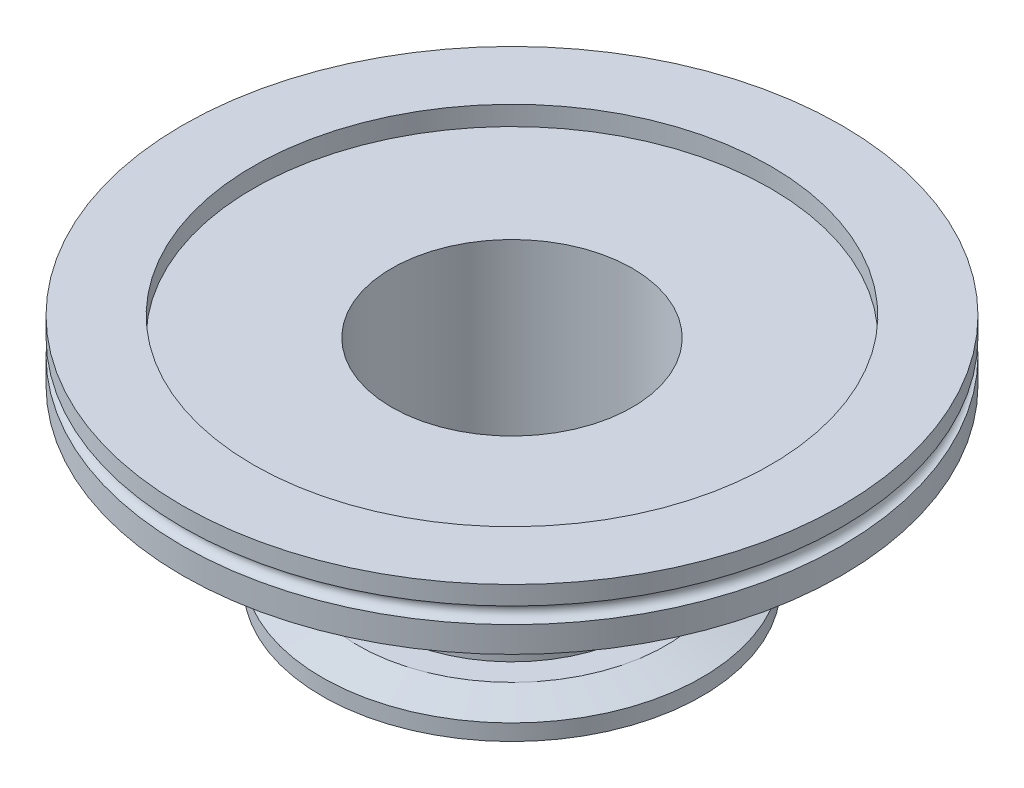
ISO-10303-21;
HEADER;
FILE_DESCRIPTION(('STEP AP214'),'2;1');
FILE_NAME('part.step','',(''),(''),'','','');
FILE_SCHEMA(('AUTOMOTIVE_DESIGN { 1 0 10303 214 1 1 1 1 }'));
ENDSEC;
DATA;
#1=APPLICATION_CONTEXT('core data for automotive mechanical design processes');
#2=APPLICATION_PROTOCOL_DEFINITION('international standard','automotive_design',2000,#1);
#3=PRODUCT_CONTEXT('',#1,'mechanical');
#4=PRODUCT('Part','Part','',(#3));
#5=PRODUCT_RELATED_PRODUCT_CATEGORY('part','',(#4));
#6=PRODUCT_DEFINITION_FORMATION('','',#4);
#7=PRODUCT_DEFINITION_CONTEXT('part definition',#1,'design');
#8=PRODUCT_DEFINITION('design','',#6,#7);
#9=PRODUCT_DEFINITION_SHAPE('','',#8);
#10=(LENGTH_UNIT() NAMED_UNIT(*) SI_UNIT(.MILLI.,.METRE.));
#11=(NAMED_UNIT(*) PLANE_ANGLE_UNIT() SI_UNIT($,.RADIAN.));
#12=(NAMED_UNIT(*) SI_UNIT($,.STERADIAN.) SOLID_ANGLE_UNIT());
#13=UNCERTAINTY_MEASURE_WITH_UNIT(LENGTH_MEASURE(1.E-05),#10,'distance_accuracy_value','');
#14=(GEOMETRIC_REPRESENTATION_CONTEXT(3) GLOBAL_UNCERTAINTY_ASSIGNED_CONTEXT((#13)) GLOBAL_UNIT_ASSIGNED_CONTEXT((#10,
#11,#12)) REPRESENTATION_CONTEXT('',''));
#15=CARTESIAN_POINT('',(0.,0.,0.));
#16=DIRECTION('',(0.,0.,1.));
#17=DIRECTION('',(1.,0.,0.));
#18=AXIS2_PLACEMENT_3D('',#15,#16,#17);
#19=CARTESIAN_POINT('',(0.,5.96900000000001,0.));
#20=DIRECTION('',(0.,1.,0.));
#21=DIRECTION('',(-1.,0.,0.));
#22=AXIS2_PLACEMENT_3D('',#19,#20,#21);
#23=CYLINDRICAL_SURFACE('',#22,64.9999999972);
#24=CARTESIAN_POINT('',(0.,2.28599999999999,0.));
#25=DIRECTION('',(0.,1.,0.));
#26=DIRECTION('',(0.,0.,1.));
#27=AXIS2_PLACEMENT_3D('',#24,#25,#26);
#28=CIRCLE('',#27,64.9999999972);
#29=CARTESIAN_POINT('',(0.,2.28599999999999,64.9999999972));
#30=VERTEX_POINT('',#29);
#31=EDGE_CURVE('E98',#30,#30,#28,.T.);
#32=ORIENTED_EDGE('',*,*,#31,.T.);
#33=EDGE_LOOP('',(#32));
#34=FACE_BOUND('',#33,.T.);
#35=CARTESIAN_POINT('',(0.,5.969,0.));
#36=DIRECTION('',(0.,1.,0.));
#37=DIRECTION('',(-1.,0.,0.));
#38=AXIS2_PLACEMENT_3D('',#35,#36,#37);
#39=CIRCLE('',#38,64.9999999972);
#40=CARTESIAN_POINT('',(-64.9999999972,5.96899999999999,0.));
#41=VERTEX_POINT('',#40);
#42=EDGE_CURVE('E49',#41,#41,#39,.T.);
#43=ORIENTED_EDGE('',*,*,#42,.F.);
#44=EDGE_LOOP('',(#43));
#45=FACE_BOUND('',#44,.T.);
#46=ADVANCED_FACE('F36',(#34,#45),#23,.T.);
#47=CARTESIAN_POINT('',(-64.9999999972,-5.96900000000001,0.));
#48=DIRECTION('',(0.,-1.,0.));
#49=DIRECTION('',(1.,0.,0.));
#50=AXIS2_PLACEMENT_3D('',#47,#48,#49);
#51=PLANE('',#50);
#52=CARTESIAN_POINT('',(0.,-5.969,0.));
#53=DIRECTION('',(0.,1.,0.));
#54=DIRECTION('',(0.,0.,1.));
#55=AXIS2_PLACEMENT_3D('',#52,#53,#54);
#56=CIRCLE('',#55,62.4599999972);
#57=CARTESIAN_POINT('',(0.,-5.969,62.4599999972));
#58=VERTEX_POINT('',#57);
#59=EDGE_CURVE('E97',#58,#58,#56,.T.);
#60=ORIENTED_EDGE('',*,*,#59,.T.);
#61=EDGE_LOOP('',(#60));
#62=FACE_BOUND('',#61,.T.);
#63=CARTESIAN_POINT('',(0.,-5.969,0.));
#64=DIRECTION('',(0.,1.,0.));
#65=DIRECTION('',(-1.,0.,0.));
#66=AXIS2_PLACEMENT_3D('',#63,#64,#65);
#67=CIRCLE('',#66,64.9999999972);
#68=CARTESIAN_POINT('',(-64.9999999972,-5.969,0.));
#69=VERTEX_POINT('',#68);
#70=EDGE_CURVE('E44',#69,#69,#67,.T.);
#71=ORIENTED_EDGE('',*,*,#70,.F.);
#72=EDGE_LOOP('',(#71));
#73=FACE_BOUND('',#72,.T.);
#74=ADVANCED_FACE('F70',(#62,#73),#51,.T.);
#75=CARTESIAN_POINT('',(0.,0.,0.));
#76=DIRECTION('',(0.,1.,0.));
#77=DIRECTION('',(0.,0.,1.));
#78=AXIS2_PLACEMENT_3D('',#75,#76,#77);
#79=CYLINDRICAL_SURFACE('',#78,25.4);
#80=CARTESIAN_POINT('',(0.,-5.969,0.));
#81=DIRECTION('',(0.,-1.,0.));
#82=DIRECTION('',(1.,0.,0.));
#83=AXIS2_PLACEMENT_3D('',#80,#81,#82);
#84=CIRCLE('',#83,25.4);
#85=CARTESIAN_POINT('',(25.4,-5.969,0.));
#86=VERTEX_POINT('',#85);
#87=EDGE_CURVE('E10',#86,#86,#84,.T.);
#88=ORIENTED_EDGE('',*,*,#87,.T.);
#89=EDGE_LOOP('',(#88));
#90=FACE_BOUND('',#89,.T.);
#91=CARTESIAN_POINT('',(0.,-35.251,0.));
#92=DIRECTION('',(0.,-1.,0.));
#93=DIRECTION('',(1.,0.,0.));
#94=AXIS2_PLACEMENT_3D('',#91,#92,#93);
#95=CIRCLE('',#94,25.4);
#96=CARTESIAN_POINT('',(25.4,-35.251,0.));
#97=VERTEX_POINT('',#96);
#98=EDGE_CURVE('E40',#97,#97,#95,.F.);
#99=ORIENTED_EDGE('',*,*,#98,.T.);
#100=EDGE_LOOP('',(#99));
#101=FACE_BOUND('',#100,.T.);
#102=ADVANCED_FACE('F76',(#90,#101),#79,.T.);
#103=CARTESIAN_POINT('',(0.,-5.969,0.));
#104=DIRECTION('',(0.,1.,0.));
#105=DIRECTION('',(0.,0.,1.));
#106=AXIS2_PLACEMENT_3D('',#103,#104,#105);
#107=CIRCLE('',#106,57.3799999972);
#108=CARTESIAN_POINT('',(0.,-5.969,57.3799999972));
#109=VERTEX_POINT('',#108);
#110=EDGE_CURVE('E101',#109,#109,#107,.T.);
#111=ORIENTED_EDGE('',*,*,#110,.F.);
#112=EDGE_LOOP('',(#111));
#113=FACE_BOUND('',#112,.T.);
#114=ORIENTED_EDGE('',*,*,#87,.F.);
#115=EDGE_LOOP('',(#114));
#116=FACE_BOUND('',#115,.T.);
#117=ADVANCED_FACE('F38',(#113,#116),#51,.T.);
#118=CARTESIAN_POINT('',(-64.9999999972,5.96899999999999,0.));
#119=DIRECTION('',(0.,1.,0.));
#120=DIRECTION('',(-1.,0.,0.));
#121=AXIS2_PLACEMENT_3D('',#118,#119,#120);
#122=PLANE('',#121);
#123=ORIENTED_EDGE('',*,*,#42,.T.);
#124=EDGE_LOOP('',(#123));
#125=FACE_BOUND('',#124,.T.);
#126=CARTESIAN_POINT('',(0.,5.96900000000001,0.));
#127=DIRECTION('',(0.,-1.,0.));
#128=DIRECTION('',(0.,0.,-1.));
#129=AXIS2_PLACEMENT_3D('',#126,#127,#128);
#130=CIRCLE('',#129,51.0299999972);
#131=CARTESIAN_POINT('',(0.,5.96900000000001,-51.0299999972));
#132=VERTEX_POINT('',#131);
#133=EDGE_CURVE('E54',#132,#132,#130,.T.);
#134=ORIENTED_EDGE('',*,*,#133,.T.);
#135=EDGE_LOOP('',(#134));
#136=FACE_BOUND('',#135,.T.);
#137=ADVANCED_FACE('F66',(#125,#136),#122,.T.);
#138=CARTESIAN_POINT('',(0.,-0.88900000000001,0.));
#139=DIRECTION('',(0.,1.,0.));
#140=DIRECTION('',(0.,0.,1.));
#141=AXIS2_PLACEMENT_3D('',#138,#139,#140);
#142=CIRCLE('',#141,64.9999999972);
#143=CARTESIAN_POINT('',(0.,-0.88900000000001,64.9999999972));
#144=VERTEX_POINT('',#143);
#145=EDGE_CURVE('E93',#144,#144,#142,.T.);
#146=ORIENTED_EDGE('',*,*,#145,.F.);
#147=EDGE_LOOP('',(#146));
#148=FACE_BOUND('',#147,.T.);
#149=ORIENTED_EDGE('',*,*,#70,.T.);
#150=EDGE_LOOP('',(#149));
#151=FACE_BOUND('',#150,.T.);
#152=ADVANCED_FACE('F72',(#148,#151),#23,.T.);
#153=CARTESIAN_POINT('',(0.,5.96900000000001,0.));
#154=DIRECTION('',(0.,-1.,0.));
#155=DIRECTION('',(0.,0.,-1.));
#156=AXIS2_PLACEMENT_3D('',#153,#154,#155);
#157=CYLINDRICAL_SURFACE('',#156,23.749);
#158=CARTESIAN_POINT('',(0.,-37.7148,0.));
#159=DIRECTION('',(0.,1.,0.));
#160=DIRECTION('',(0.,0.,1.));
#161=AXIS2_PLACEMENT_3D('',#158,#159,#160);
#162=CIRCLE('',#161,23.749);
#163=CARTESIAN_POINT('',(0.,-37.7148,23.749));
#164=VERTEX_POINT('',#163);
#165=EDGE_CURVE('E52',#164,#164,#162,.T.);
#166=ORIENTED_EDGE('',*,*,#165,.F.);
#167=EDGE_LOOP('',(#166));
#168=FACE_BOUND('',#167,.T.);
#169=CARTESIAN_POINT('',(0.,2.15900000000001,0.));
#170=DIRECTION('',(0.,-1.,0.));
#171=DIRECTION('',(0.,0.,-1.));
#172=AXIS2_PLACEMENT_3D('',#169,#170,#171);
#173=CIRCLE('',#172,23.749);
#174=CARTESIAN_POINT('',(0.,2.15900000000001,-23.749));
#175=VERTEX_POINT('',#174);
#176=EDGE_CURVE('E60',#175,#175,#173,.T.);
#177=ORIENTED_EDGE('',*,*,#176,.F.);
#178=EDGE_LOOP('',(#177));
#179=FACE_BOUND('',#178,.T.);
#180=ADVANCED_FACE('F81',(#168,#179),#157,.F.);
#181=CARTESIAN_POINT('',(-23.749,2.159,0.));
#182=DIRECTION('',(0.,1.,0.));
#183=DIRECTION('',(0.,0.,1.));
#184=AXIS2_PLACEMENT_3D('',#181,#182,#183);
#185=PLANE('',#184);
#186=CARTESIAN_POINT('',(0.,2.159,0.));
#187=DIRECTION('',(0.,-1.,0.));
#188=DIRECTION('',(0.,0.,-1.));
#189=AXIS2_PLACEMENT_3D('',#186,#187,#188);
#190=CIRCLE('',#189,51.0299999972);
#191=CARTESIAN_POINT('',(0.,2.159,-51.0299999972));
#192=VERTEX_POINT('',#191);
#193=EDGE_CURVE('E57',#192,#192,#190,.T.);
#194=ORIENTED_EDGE('',*,*,#193,.F.);
#195=EDGE_LOOP('',(#194));
#196=FACE_BOUND('',#195,.T.);
#197=ORIENTED_EDGE('',*,*,#176,.T.);
#198=EDGE_LOOP('',(#197));
#199=FACE_BOUND('',#198,.T.);
#200=ADVANCED_FACE('F87',(#196,#199),#185,.T.);
#201=CARTESIAN_POINT('',(0.,5.96900000000001,0.));
#202=DIRECTION('',(0.,-1.,0.));
#203=DIRECTION('',(0.,0.,-1.));
#204=AXIS2_PLACEMENT_3D('',#201,#202,#203);
#205=CYLINDRICAL_SURFACE('',#204,51.0299999972);
#206=ORIENTED_EDGE('',*,*,#193,.T.);
#207=EDGE_LOOP('',(#206));
#208=FACE_BOUND('',#207,.T.);
#209=ORIENTED_EDGE('',*,*,#133,.F.);
#210=EDGE_LOOP('',(#209));
#211=FACE_BOUND('',#210,.T.);
#212=ADVANCED_FACE('F140',(#208,#211),#205,.F.);
#213=CARTESIAN_POINT('',(-23.749,-37.7148,0.));
#214=DIRECTION('',(0.,-1.,0.));
#215=DIRECTION('',(0.,0.,-1.));
#216=AXIS2_PLACEMENT_3D('',#213,#214,#215);
#217=PLANE('',#216);
#218=ORIENTED_EDGE('',*,*,#165,.T.);
#219=EDGE_LOOP('',(#218));
#220=FACE_BOUND('',#219,.T.);
#221=CARTESIAN_POINT('',(0.,-37.7148,0.));
#222=DIRECTION('',(0.,1.,0.));
#223=DIRECTION('',(-1.,0.,0.));
#224=AXIS2_PLACEMENT_3D('',#221,#222,#223);
#225=CIRCLE('',#224,26.1239);
#226=CARTESIAN_POINT('',(-26.1239,-37.7148,0.));
#227=VERTEX_POINT('',#226);
#228=EDGE_CURVE('E124',#227,#227,#225,.T.);
#229=ORIENTED_EDGE('',*,*,#228,.F.);
#230=EDGE_LOOP('',(#229));
#231=FACE_BOUND('',#230,.T.);
#232=ADVANCED_FACE('F134',(#220,#231),#217,.T.);
#233=CARTESIAN_POINT('',(0.,5.96900000000001,0.));
#234=DIRECTION('',(0.,1.,0.));
#235=DIRECTION('',(-1.,0.,0.));
#236=AXIS2_PLACEMENT_3D('',#233,#234,#235);
#237=CYLINDRICAL_SURFACE('',#236,26.1239);
#238=ORIENTED_EDGE('',*,*,#228,.T.);
#239=EDGE_LOOP('',(#238));
#240=FACE_BOUND('',#239,.T.);
#241=CARTESIAN_POINT('',(0.,-40.331,0.));
#242=DIRECTION('',(0.,1.,0.));
#243=DIRECTION('',(-1.,0.,0.));
#244=AXIS2_PLACEMENT_3D('',#241,#242,#243);
#245=CIRCLE('',#244,26.1239);
#246=CARTESIAN_POINT('',(-26.1239,-40.331,0.));
#247=VERTEX_POINT('',#246);
#248=EDGE_CURVE('E122',#247,#247,#245,.T.);
#249=ORIENTED_EDGE('',*,*,#248,.F.);
#250=EDGE_LOOP('',(#249));
#251=FACE_BOUND('',#250,.T.);
#252=ADVANCED_FACE('F152',(#240,#251),#237,.F.);
#253=CARTESIAN_POINT('',(0.,-40.331,0.));
#254=DIRECTION('',(0.,1.,0.));
#255=DIRECTION('',(-1.,0.,0.));
#256=AXIS2_PLACEMENT_3D('',#253,#254,#255);
#257=PLANE('',#256);
#258=CARTESIAN_POINT('',(0.,-40.331,0.));
#259=DIRECTION('',(0.,1.,0.));
#260=DIRECTION('',(-1.,0.,0.));
#261=AXIS2_PLACEMENT_3D('',#258,#259,#260);
#262=CIRCLE('',#261,37.465);
#263=CARTESIAN_POINT('',(-37.465,-40.331,0.));
#264=VERTEX_POINT('',#263);
#265=EDGE_CURVE('E119',#264,#264,#262,.T.);
#266=ORIENTED_EDGE('',*,*,#265,.F.);
#267=EDGE_LOOP('',(#266));
#268=FACE_BOUND('',#267,.T.);
#269=ORIENTED_EDGE('',*,*,#248,.T.);
#270=EDGE_LOOP('',(#269));
#271=FACE_BOUND('',#270,.T.);
#272=ADVANCED_FACE('F157',(#268,#271),#257,.F.);
#273=CARTESIAN_POINT('',(0.,5.96900000000001,0.));
#274=DIRECTION('',(0.,1.,0.));
#275=DIRECTION('',(-1.,0.,0.));
#276=AXIS2_PLACEMENT_3D('',#273,#274,#275);
#277=CYLINDRICAL_SURFACE('',#276,37.465);
#278=CARTESIAN_POINT('',(0.,-37.156,0.));
#279=DIRECTION('',(0.,1.,0.));
#280=DIRECTION('',(-1.,0.,0.));
#281=AXIS2_PLACEMENT_3D('',#278,#279,#280);
#282=CIRCLE('',#281,37.465);
#283=CARTESIAN_POINT('',(-37.465,-37.156,0.));
#284=VERTEX_POINT('',#283);
#285=EDGE_CURVE('E116',#284,#284,#282,.T.);
#286=ORIENTED_EDGE('',*,*,#285,.F.);
#287=EDGE_LOOP('',(#286));
#288=FACE_BOUND('',#287,.T.);
#289=ORIENTED_EDGE('',*,*,#265,.T.);
#290=EDGE_LOOP('',(#289));
#291=FACE_BOUND('',#290,.T.);
#292=ADVANCED_FACE('F160',(#288,#291),#277,.T.);
#293=CARTESIAN_POINT('',(0.,-37.156,0.));
#294=DIRECTION('',(0.,-1.,0.));
#295=DIRECTION('',(1.,0.,0.));
#296=AXIS2_PLACEMENT_3D('',#293,#294,#295);
#297=CONICAL_SURFACE('',#296,37.465,1.30899693899575);
#298=CARTESIAN_POINT('',(0.,-35.251,0.));
#299=DIRECTION('',(0.,1.,0.));
#300=DIRECTION('',(-1.,0.,0.));
#301=AXIS2_PLACEMENT_3D('',#298,#299,#300);
#302=CIRCLE('',#301,30.3554432115812);
#303=CARTESIAN_POINT('',(-30.3554432115812,-35.251,0.));
#304=VERTEX_POINT('',#303);
#305=EDGE_CURVE('E113',#304,#304,#302,.T.);
#306=ORIENTED_EDGE('',*,*,#305,.F.);
#307=EDGE_LOOP('',(#306));
#308=FACE_BOUND('',#307,.T.);
#309=ORIENTED_EDGE('',*,*,#285,.T.);
#310=EDGE_LOOP('',(#309));
#311=FACE_BOUND('',#310,.T.);
#312=ADVANCED_FACE('F164',(#308,#311),#297,.T.);
#313=CARTESIAN_POINT('',(0.,-35.251,0.));
#314=DIRECTION('',(0.,-1.,0.));
#315=DIRECTION('',(1.,0.,0.));
#316=AXIS2_PLACEMENT_3D('',#313,#314,#315);
#317=PLANE('',#316);
#318=ORIENTED_EDGE('',*,*,#98,.F.);
#319=EDGE_LOOP('',(#318));
#320=FACE_BOUND('',#319,.T.);
#321=ORIENTED_EDGE('',*,*,#305,.T.);
#322=EDGE_LOOP('',(#321));
#323=FACE_BOUND('',#322,.T.);
#324=ADVANCED_FACE('F168',(#320,#323),#317,.F.);
#325=CARTESIAN_POINT('',(0.,0.,0.));
#326=DIRECTION('',(0.,1.,0.));
#327=DIRECTION('',(0.,0.,1.));
#328=AXIS2_PLACEMENT_3D('',#325,#326,#327);
#329=CYLINDRICAL_SURFACE('',#328,62.4599999972);
#330=ORIENTED_EDGE('',*,*,#59,.F.);
#331=EDGE_LOOP('',(#330));
#332=FACE_BOUND('',#331,.T.);
#333=CARTESIAN_POINT('',(0.,-3.937,0.));
#334=DIRECTION('',(0.,1.,0.));
#335=DIRECTION('',(0.,0.,1.));
#336=AXIS2_PLACEMENT_3D('',#333,#334,#335);
#337=CIRCLE('',#336,62.4599999972);
#338=CARTESIAN_POINT('',(0.,-3.937,62.4599999972));
#339=VERTEX_POINT('',#338);
#340=EDGE_CURVE('E110',#339,#339,#337,.T.);
#341=ORIENTED_EDGE('',*,*,#340,.T.);
#342=EDGE_LOOP('',(#341));
#343=FACE_BOUND('',#342,.T.);
#344=ADVANCED_FACE('F172',(#332,#343),#329,.F.);
#345=CARTESIAN_POINT('',(-62.4599999972,-3.937,0.));
#346=DIRECTION('',(0.,1.,0.));
#347=DIRECTION('',(0.,0.,1.));
#348=AXIS2_PLACEMENT_3D('',#345,#346,#347);
#349=PLANE('',#348);
#350=ORIENTED_EDGE('',*,*,#340,.F.);
#351=EDGE_LOOP('',(#350));
#352=FACE_BOUND('',#351,.T.);
#353=CARTESIAN_POINT('',(0.,-3.937,0.));
#354=DIRECTION('',(0.,1.,0.));
#355=DIRECTION('',(0.,0.,1.));
#356=AXIS2_PLACEMENT_3D('',#353,#354,#355);
#357=CIRCLE('',#356,57.3799999972);
#358=CARTESIAN_POINT('',(0.,-3.937,57.3799999972));
#359=VERTEX_POINT('',#358);
#360=EDGE_CURVE('E107',#359,#359,#357,.T.);
#361=ORIENTED_EDGE('',*,*,#360,.T.);
#362=EDGE_LOOP('',(#361));
#363=FACE_BOUND('',#362,.T.);
#364=ADVANCED_FACE('F176',(#352,#363),#349,.F.);
#365=CARTESIAN_POINT('',(0.,0.,0.));
#366=DIRECTION('',(0.,1.,0.));
#367=DIRECTION('',(0.,0.,1.));
#368=AXIS2_PLACEMENT_3D('',#365,#366,#367);
#369=CYLINDRICAL_SURFACE('',#368,57.3799999972);
#370=ORIENTED_EDGE('',*,*,#360,.F.);
#371=EDGE_LOOP('',(#370));
#372=FACE_BOUND('',#371,.T.);
#373=ORIENTED_EDGE('',*,*,#110,.T.);
#374=EDGE_LOOP('',(#373));
#375=FACE_BOUND('',#374,.T.);
#376=ADVANCED_FACE('F180',(#372,#375),#369,.T.);
#377=CARTESIAN_POINT('',(0.,0.69849999999999,0.));
#378=DIRECTION('',(0.,1.,0.));
#379=DIRECTION('',(0.,0.,1.));
#380=AXIS2_PLACEMENT_3D('',#377,#378,#379);
#381=TOROIDAL_SURFACE('',#380,64.9999999972,1.5875);
#382=ORIENTED_EDGE('',*,*,#31,.F.);
#383=EDGE_LOOP('',(#382));
#384=FACE_BOUND('',#383,.T.);
#385=ORIENTED_EDGE('',*,*,#145,.T.);
#386=EDGE_LOOP('',(#385));
#387=FACE_BOUND('',#386,.T.);
#388=ADVANCED_FACE('F184',(#384,#387),#381,.F.);
#389=CLOSED_SHELL('',(#46,#74,#102,#117,#137,#152,#180,#200,#212,#232,#252,#272,#292,#312,#324,
#344,#364,#376,#388));
#390=MANIFOLD_SOLID_BREP('B2',#389);
#391=ADVANCED_BREP_SHAPE_REPRESENTATION('',(#18,#390),#14);
#392=SHAPE_DEFINITION_REPRESENTATION(#9,#391);
ENDSEC;
END-ISO-10303-21;
